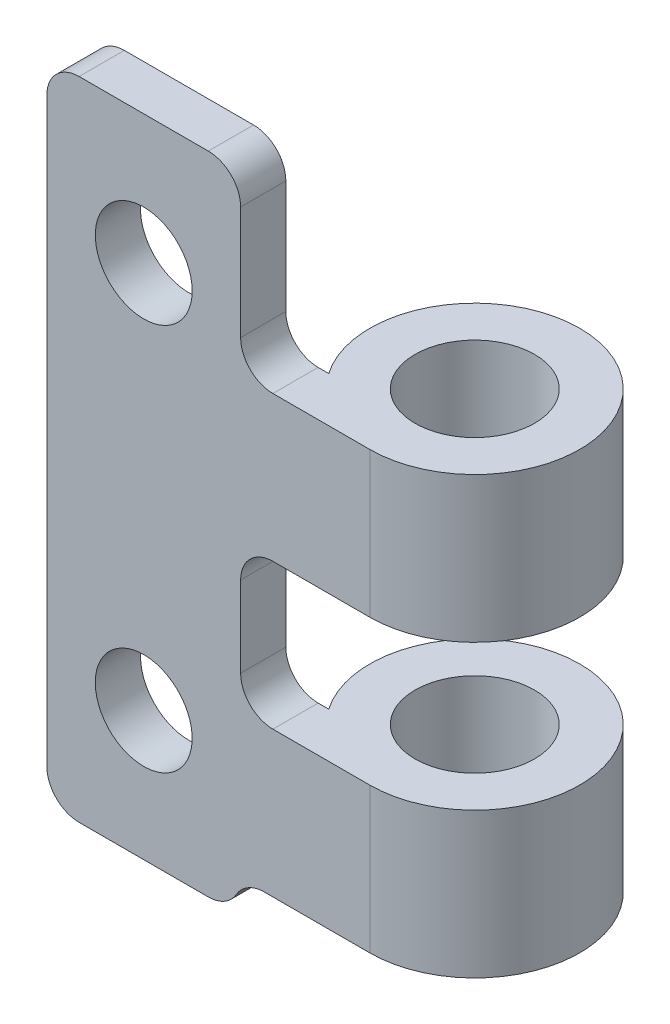
ISO-10303-21;
HEADER;
FILE_DESCRIPTION(('STEP AP214'),'2;1');
FILE_NAME('part.step','',(''),(''),'','','');
FILE_SCHEMA(('AUTOMOTIVE_DESIGN { 1 0 10303 214 1 1 1 1 }'));
ENDSEC;
DATA;
#1=APPLICATION_CONTEXT('core data for automotive mechanical design processes');
#2=APPLICATION_PROTOCOL_DEFINITION('international standard','automotive_design',2000,#1);
#3=PRODUCT_CONTEXT('',#1,'mechanical');
#4=PRODUCT('Part','Part','',(#3));
#5=PRODUCT_RELATED_PRODUCT_CATEGORY('part','',(#4));
#6=PRODUCT_DEFINITION_FORMATION('','',#4);
#7=PRODUCT_DEFINITION_CONTEXT('part definition',#1,'design');
#8=PRODUCT_DEFINITION('design','',#6,#7);
#9=PRODUCT_DEFINITION_SHAPE('','',#8);
#10=(LENGTH_UNIT() NAMED_UNIT(*) SI_UNIT(.MILLI.,.METRE.));
#11=(NAMED_UNIT(*) PLANE_ANGLE_UNIT() SI_UNIT($,.RADIAN.));
#12=(NAMED_UNIT(*) SI_UNIT($,.STERADIAN.) SOLID_ANGLE_UNIT());
#13=UNCERTAINTY_MEASURE_WITH_UNIT(LENGTH_MEASURE(1.E-05),#10,'distance_accuracy_value','');
#14=(GEOMETRIC_REPRESENTATION_CONTEXT(3) GLOBAL_UNCERTAINTY_ASSIGNED_CONTEXT((#13)) GLOBAL_UNIT_ASSIGNED_CONTEXT((#10,
#11,#12)) REPRESENTATION_CONTEXT('',''));
#15=CARTESIAN_POINT('',(0.,0.,0.));
#16=DIRECTION('',(0.,0.,1.));
#17=DIRECTION('',(1.,0.,0.));
#18=AXIS2_PLACEMENT_3D('',#15,#16,#17);
#19=CARTESIAN_POINT('',(2.,-9.,0.));
#20=DIRECTION('',(0.,0.,1.));
#21=DIRECTION('',(1.,0.,0.));
#22=AXIS2_PLACEMENT_3D('',#19,#20,#21);
#23=PLANE('',#22);
#24=CARTESIAN_POINT('',(0.,-6.,0.));
#25=DIRECTION('',(0.,0.,1.));
#26=DIRECTION('',(-1.,0.,0.));
#27=AXIS2_PLACEMENT_3D('',#24,#25,#26);
#28=CIRCLE('',#27,1.5);
#29=CARTESIAN_POINT('',(-1.5,-6.,0.));
#30=VERTEX_POINT('',#29);
#31=EDGE_CURVE('E232',#30,#30,#28,.T.);
#32=ORIENTED_EDGE('',*,*,#31,.T.);
#33=EDGE_LOOP('',(#32));
#34=FACE_BOUND('',#33,.T.);
#35=CARTESIAN_POINT('',(0.,6.,0.));
#36=DIRECTION('',(0.,0.,1.));
#37=DIRECTION('',(1.,0.,0.));
#38=AXIS2_PLACEMENT_3D('',#35,#36,#37);
#39=CIRCLE('',#38,1.5);
#40=CARTESIAN_POINT('',(1.5,6.,0.));
#41=VERTEX_POINT('',#40);
#42=EDGE_CURVE('E236',#41,#41,#39,.T.);
#43=ORIENTED_EDGE('',*,*,#42,.T.);
#44=EDGE_LOOP('',(#43));
#45=FACE_BOUND('',#44,.T.);
#46=DIRECTION('',(0.,1.,0.));
#47=VECTOR('',#46,1.);
#48=CARTESIAN_POINT('',(4.32792215682252,-13.6923881554251,0.));
#49=LINE('',#48,#47);
#50=CARTESIAN_POINT('',(4.32792215682252,0.,0.));
#51=VERTEX_POINT('',#50);
#52=CARTESIAN_POINT('',(4.32792215682252,4.5,0.));
#53=VERTEX_POINT('',#52);
#54=EDGE_CURVE('E182',#51,#53,#49,.T.);
#55=ORIENTED_EDGE('',*,*,#54,.F.);
#56=DIRECTION('',(1.,0.,0.));
#57=VECTOR('',#56,1.);
#58=CARTESIAN_POINT('',(3.,0.,0.));
#59=LINE('',#58,#57);
#60=CARTESIAN_POINT('',(4.,0.,0.));
#61=VERTEX_POINT('',#60);
#62=EDGE_CURVE('E195',#61,#51,#59,.T.);
#63=ORIENTED_EDGE('',*,*,#62,.F.);
#64=CARTESIAN_POINT('',(4.,-1.,0.));
#65=DIRECTION('',(0.,0.,1.));
#66=DIRECTION('',(1.,0.,0.));
#67=AXIS2_PLACEMENT_3D('',#64,#65,#66);
#68=CIRCLE('',#67,1.);
#69=CARTESIAN_POINT('',(3.,-1.,0.));
#70=VERTEX_POINT('',#69);
#71=EDGE_CURVE('E327',#61,#70,#68,.T.);
#72=ORIENTED_EDGE('',*,*,#71,.T.);
#73=DIRECTION('',(0.,1.,0.));
#74=VECTOR('',#73,1.);
#75=CARTESIAN_POINT('',(3.,-8.99999999999999,0.));
#76=LINE('',#75,#74);
#77=CARTESIAN_POINT('',(3.,-3.5,0.));
#78=VERTEX_POINT('',#77);
#79=EDGE_CURVE('E268',#78,#70,#76,.T.);
#80=ORIENTED_EDGE('',*,*,#79,.F.);
#81=CARTESIAN_POINT('',(4.,-3.5,0.));
#82=DIRECTION('',(0.,0.,1.));
#83=DIRECTION('',(1.,0.,0.));
#84=AXIS2_PLACEMENT_3D('',#81,#82,#83);
#85=CIRCLE('',#84,1.);
#86=CARTESIAN_POINT('',(4.,-4.5,0.));
#87=VERTEX_POINT('',#86);
#88=EDGE_CURVE('E323',#78,#87,#85,.T.);
#89=ORIENTED_EDGE('',*,*,#88,.T.);
#90=DIRECTION('',(1.,0.,0.));
#91=VECTOR('',#90,1.);
#92=CARTESIAN_POINT('',(3.,-4.5,0.));
#93=LINE('',#92,#91);
#94=CARTESIAN_POINT('',(4.32792215682252,-4.5,0.));
#95=VERTEX_POINT('',#94);
#96=EDGE_CURVE('E220',#87,#95,#93,.T.);
#97=ORIENTED_EDGE('',*,*,#96,.T.);
#98=DIRECTION('',(0.,-1.,0.));
#99=VECTOR('',#98,1.);
#100=CARTESIAN_POINT('',(4.32792215682252,4.69238815542511,0.));
#101=LINE('',#100,#99);
#102=CARTESIAN_POINT('',(4.32792215682252,-9.,0.));
#103=VERTEX_POINT('',#102);
#104=EDGE_CURVE('E216',#95,#103,#101,.T.);
#105=ORIENTED_EDGE('',*,*,#104,.T.);
#106=DIRECTION('',(1.,0.,0.));
#107=VECTOR('',#106,1.);
#108=CARTESIAN_POINT('',(3.,-9.,0.));
#109=LINE('',#108,#107);
#110=CARTESIAN_POINT('',(3.73205080756888,-9.,0.));
#111=VERTEX_POINT('',#110);
#112=EDGE_CURVE('E219',#111,#103,#109,.T.);
#113=ORIENTED_EDGE('',*,*,#112,.F.);
#114=CARTESIAN_POINT('',(3.73205080756888,-10.,0.));
#115=DIRECTION('',(0.,0.,1.));
#116=DIRECTION('',(1.,0.,0.));
#117=AXIS2_PLACEMENT_3D('',#114,#115,#116);
#118=CIRCLE('',#117,1.);
#119=CARTESIAN_POINT('',(2.86602540378444,-9.5,0.));
#120=VERTEX_POINT('',#119);
#121=EDGE_CURVE('E319',#111,#120,#118,.T.);
#122=ORIENTED_EDGE('',*,*,#121,.T.);
#123=CARTESIAN_POINT('',(2.,-9.,0.));
#124=DIRECTION('',(0.,0.,1.));
#125=DIRECTION('',(1.,0.,0.));
#126=AXIS2_PLACEMENT_3D('',#123,#124,#125);
#127=CIRCLE('',#126,0.999999999999999);
#128=CARTESIAN_POINT('',(1.99999999999999,-10.,0.));
#129=VERTEX_POINT('',#128);
#130=EDGE_CURVE('E242',#129,#120,#127,.T.);
#131=ORIENTED_EDGE('',*,*,#130,.F.);
#132=DIRECTION('',(1.,0.,0.));
#133=VECTOR('',#132,1.);
#134=CARTESIAN_POINT('',(-1.99999999999999,-10.,0.));
#135=LINE('',#134,#133);
#136=CARTESIAN_POINT('',(-1.99999999999999,-10.,0.));
#137=VERTEX_POINT('',#136);
#138=EDGE_CURVE('E248',#137,#129,#135,.T.);
#139=ORIENTED_EDGE('',*,*,#138,.F.);
#140=CARTESIAN_POINT('',(-2.,-9.,0.));
#141=DIRECTION('',(0.,0.,1.));
#142=DIRECTION('',(-1.,0.,0.));
#143=AXIS2_PLACEMENT_3D('',#140,#141,#142);
#144=CIRCLE('',#143,0.999999999999999);
#145=CARTESIAN_POINT('',(-3.,-9.,0.));
#146=VERTEX_POINT('',#145);
#147=EDGE_CURVE('E277',#146,#137,#144,.T.);
#148=ORIENTED_EDGE('',*,*,#147,.F.);
#149=DIRECTION('',(0.,-1.,0.));
#150=VECTOR('',#149,1.);
#151=CARTESIAN_POINT('',(-3.,-8.99999999999999,0.));
#152=LINE('',#151,#150);
#153=CARTESIAN_POINT('',(-3.,8.99999999999999,0.));
#154=VERTEX_POINT('',#153);
#155=EDGE_CURVE('E275',#154,#146,#152,.T.);
#156=ORIENTED_EDGE('',*,*,#155,.F.);
#157=CARTESIAN_POINT('',(-2.,9.,0.));
#158=DIRECTION('',(0.,0.,1.));
#159=DIRECTION('',(-1.,0.,0.));
#160=AXIS2_PLACEMENT_3D('',#157,#158,#159);
#161=CIRCLE('',#160,0.999999999999999);
#162=CARTESIAN_POINT('',(-1.99999999999999,10.,0.));
#163=VERTEX_POINT('',#162);
#164=EDGE_CURVE('E273',#163,#154,#161,.T.);
#165=ORIENTED_EDGE('',*,*,#164,.F.);
#166=DIRECTION('',(-1.,0.,0.));
#167=VECTOR('',#166,1.);
#168=CARTESIAN_POINT('',(-1.99999999999999,10.,0.));
#169=LINE('',#168,#167);
#170=CARTESIAN_POINT('',(1.99999999999999,10.,0.));
#171=VERTEX_POINT('',#170);
#172=EDGE_CURVE('E271',#171,#163,#169,.T.);
#173=ORIENTED_EDGE('',*,*,#172,.F.);
#174=CARTESIAN_POINT('',(2.,9.,0.));
#175=DIRECTION('',(0.,0.,1.));
#176=DIRECTION('',(-1.,0.,0.));
#177=AXIS2_PLACEMENT_3D('',#174,#175,#176);
#178=CIRCLE('',#177,0.999999999999999);
#179=CARTESIAN_POINT('',(3.,8.99999999999999,0.));
#180=VERTEX_POINT('',#179);
#181=EDGE_CURVE('E269',#180,#171,#178,.T.);
#182=ORIENTED_EDGE('',*,*,#181,.F.);
#183=CARTESIAN_POINT('',(3.,5.5,0.));
#184=VERTEX_POINT('',#183);
#185=EDGE_CURVE('E266',#184,#180,#76,.T.);
#186=ORIENTED_EDGE('',*,*,#185,.F.);
#187=CARTESIAN_POINT('',(4.,5.5,0.));
#188=DIRECTION('',(0.,0.,1.));
#189=DIRECTION('',(1.,0.,0.));
#190=AXIS2_PLACEMENT_3D('',#187,#188,#189);
#191=CIRCLE('',#190,1.);
#192=CARTESIAN_POINT('',(4.,4.5,0.));
#193=VERTEX_POINT('',#192);
#194=EDGE_CURVE('E52',#184,#193,#191,.T.);
#195=ORIENTED_EDGE('',*,*,#194,.T.);
#196=DIRECTION('',(1.,0.,0.));
#197=VECTOR('',#196,1.);
#198=CARTESIAN_POINT('',(3.,4.5,0.));
#199=LINE('',#198,#197);
#200=EDGE_CURVE('E198',#193,#53,#199,.T.);
#201=ORIENTED_EDGE('',*,*,#200,.T.);
#202=EDGE_LOOP('',(#55,#63,#72,#80,#89,#97,#105,#113,#122,#131,#139,#148,#156,#165,#173,#182,
#186,#195,#201));
#203=FACE_BOUND('',#202,.T.);
#204=ADVANCED_FACE('F44',(#34,#45,#203),#23,.F.);
#205=CARTESIAN_POINT('',(3.,-8.99999999999999,1.4));
#206=DIRECTION('',(-1.,0.,0.));
#207=DIRECTION('',(0.,0.,1.));
#208=AXIS2_PLACEMENT_3D('',#205,#206,#207);
#209=PLANE('',#208);
#210=DIRECTION('',(0.,1.,0.));
#211=VECTOR('',#210,1.);
#212=CARTESIAN_POINT('',(3.,-8.99999999999999,1.4));
#213=LINE('',#212,#211);
#214=CARTESIAN_POINT('',(3.,5.5,1.4));
#215=VERTEX_POINT('',#214);
#216=CARTESIAN_POINT('',(3.,8.99999999999999,1.4));
#217=VERTEX_POINT('',#216);
#218=EDGE_CURVE('E247',#215,#217,#213,.T.);
#219=ORIENTED_EDGE('',*,*,#218,.F.);
#220=DIRECTION('',(0.,0.,-1.));
#221=VECTOR('',#220,1.);
#222=CARTESIAN_POINT('',(3.,5.5,0.));
#223=LINE('',#222,#221);
#224=EDGE_CURVE('E315',#215,#184,#223,.T.);
#225=ORIENTED_EDGE('',*,*,#224,.T.);
#226=ORIENTED_EDGE('',*,*,#185,.T.);
#227=DIRECTION('',(0.,0.,-1.));
#228=VECTOR('',#227,1.);
#229=CARTESIAN_POINT('',(3.,8.99999999999999,1.4));
#230=LINE('',#229,#228);
#231=EDGE_CURVE('E297',#217,#180,#230,.T.);
#232=ORIENTED_EDGE('',*,*,#231,.F.);
#233=EDGE_LOOP('',(#219,#225,#226,#232));
#234=FACE_BOUND('',#233,.T.);
#235=ADVANCED_FACE('F403',(#234),#209,.F.);
#236=CARTESIAN_POINT('',(2.,-9.,1.4));
#237=DIRECTION('',(0.,0.,1.));
#238=DIRECTION('',(1.,0.,0.));
#239=AXIS2_PLACEMENT_3D('',#236,#237,#238);
#240=PLANE('',#239);
#241=CARTESIAN_POINT('',(0.,6.,1.4));
#242=DIRECTION('',(0.,0.,1.));
#243=DIRECTION('',(1.,0.,0.));
#244=AXIS2_PLACEMENT_3D('',#241,#242,#243);
#245=CIRCLE('',#244,1.5);
#246=CARTESIAN_POINT('',(1.5,6.,1.4));
#247=VERTEX_POINT('',#246);
#248=EDGE_CURVE('E239',#247,#247,#245,.T.);
#249=ORIENTED_EDGE('',*,*,#248,.F.);
#250=EDGE_LOOP('',(#249));
#251=FACE_BOUND('',#250,.T.);
#252=CARTESIAN_POINT('',(2.,-9.,1.4));
#253=DIRECTION('',(0.,0.,1.));
#254=DIRECTION('',(1.,0.,0.));
#255=AXIS2_PLACEMENT_3D('',#252,#253,#254);
#256=CIRCLE('',#255,0.999999999999999);
#257=CARTESIAN_POINT('',(1.99999999999999,-10.,1.4));
#258=VERTEX_POINT('',#257);
#259=CARTESIAN_POINT('',(2.86602540378444,-9.5,1.4));
#260=VERTEX_POINT('',#259);
#261=EDGE_CURVE('E245',#258,#260,#256,.T.);
#262=ORIENTED_EDGE('',*,*,#261,.T.);
#263=CARTESIAN_POINT('',(3.73205080756888,-10.,1.4));
#264=DIRECTION('',(0.,0.,1.));
#265=DIRECTION('',(1.,0.,0.));
#266=AXIS2_PLACEMENT_3D('',#263,#264,#265);
#267=CIRCLE('',#266,1.);
#268=CARTESIAN_POINT('',(3.73205080756888,-9.,1.4));
#269=VERTEX_POINT('',#268);
#270=EDGE_CURVE('E321',#260,#269,#267,.F.);
#271=ORIENTED_EDGE('',*,*,#270,.T.);
#272=DIRECTION('',(-1.,0.,0.));
#273=VECTOR('',#272,1.);
#274=CARTESIAN_POINT('',(3.,-9.,1.4));
#275=LINE('',#274,#273);
#276=CARTESIAN_POINT('',(7.,-9.,1.4));
#277=VERTEX_POINT('',#276);
#278=EDGE_CURVE('E223',#277,#269,#275,.T.);
#279=ORIENTED_EDGE('',*,*,#278,.F.);
#280=DIRECTION('',(0.,-1.,0.));
#281=VECTOR('',#280,1.);
#282=CARTESIAN_POINT('',(7.,-4.5,1.4));
#283=LINE('',#282,#281);
#284=CARTESIAN_POINT('',(7.,-4.5,1.4));
#285=VERTEX_POINT('',#284);
#286=EDGE_CURVE('E226',#285,#277,#283,.T.);
#287=ORIENTED_EDGE('',*,*,#286,.F.);
#288=DIRECTION('',(-1.,0.,0.));
#289=VECTOR('',#288,1.);
#290=CARTESIAN_POINT('',(3.,-4.5,1.4));
#291=LINE('',#290,#289);
#292=CARTESIAN_POINT('',(4.,-4.5,1.4));
#293=VERTEX_POINT('',#292);
#294=EDGE_CURVE('E222',#285,#293,#291,.T.);
#295=ORIENTED_EDGE('',*,*,#294,.T.);
#296=CARTESIAN_POINT('',(4.,-3.5,1.4));
#297=DIRECTION('',(0.,0.,1.));
#298=DIRECTION('',(1.,0.,0.));
#299=AXIS2_PLACEMENT_3D('',#296,#297,#298);
#300=CIRCLE('',#299,1.);
#301=CARTESIAN_POINT('',(3.,-3.5,1.4));
#302=VERTEX_POINT('',#301);
#303=EDGE_CURVE('E325',#293,#302,#300,.F.);
#304=ORIENTED_EDGE('',*,*,#303,.T.);
#305=CARTESIAN_POINT('',(3.,-1.,1.4));
#306=VERTEX_POINT('',#305);
#307=EDGE_CURVE('E250',#302,#306,#213,.T.);
#308=ORIENTED_EDGE('',*,*,#307,.T.);
#309=CARTESIAN_POINT('',(4.,-1.,1.4));
#310=DIRECTION('',(0.,0.,1.));
#311=DIRECTION('',(1.,0.,0.));
#312=AXIS2_PLACEMENT_3D('',#309,#310,#311);
#313=CIRCLE('',#312,1.);
#314=CARTESIAN_POINT('',(4.,0.,1.4));
#315=VERTEX_POINT('',#314);
#316=EDGE_CURVE('E329',#306,#315,#313,.F.);
#317=ORIENTED_EDGE('',*,*,#316,.T.);
#318=DIRECTION('',(-1.,0.,0.));
#319=VECTOR('',#318,1.);
#320=CARTESIAN_POINT('',(3.,0.,1.4));
#321=LINE('',#320,#319);
#322=CARTESIAN_POINT('',(7.,0.,1.4));
#323=VERTEX_POINT('',#322);
#324=EDGE_CURVE('E193',#323,#315,#321,.T.);
#325=ORIENTED_EDGE('',*,*,#324,.F.);
#326=DIRECTION('',(0.,1.,0.));
#327=VECTOR('',#326,1.);
#328=CARTESIAN_POINT('',(7.,0.,1.4));
#329=LINE('',#328,#327);
#330=CARTESIAN_POINT('',(7.,4.5,1.4));
#331=VERTEX_POINT('',#330);
#332=EDGE_CURVE('E179',#323,#331,#329,.T.);
#333=ORIENTED_EDGE('',*,*,#332,.T.);
#334=DIRECTION('',(-1.,0.,0.));
#335=VECTOR('',#334,1.);
#336=CARTESIAN_POINT('',(3.,4.5,1.4));
#337=LINE('',#336,#335);
#338=CARTESIAN_POINT('',(4.,4.5,1.4));
#339=VERTEX_POINT('',#338);
#340=EDGE_CURVE('E190',#331,#339,#337,.T.);
#341=ORIENTED_EDGE('',*,*,#340,.T.);
#342=CARTESIAN_POINT('',(4.,5.5,1.4));
#343=DIRECTION('',(0.,0.,1.));
#344=DIRECTION('',(1.,0.,0.));
#345=AXIS2_PLACEMENT_3D('',#342,#343,#344);
#346=CIRCLE('',#345,1.);
#347=EDGE_CURVE('E11',#339,#215,#346,.F.);
#348=ORIENTED_EDGE('',*,*,#347,.T.);
#349=ORIENTED_EDGE('',*,*,#218,.T.);
#350=CARTESIAN_POINT('',(2.,9.,1.4));
#351=DIRECTION('',(0.,0.,1.));
#352=DIRECTION('',(-1.,0.,0.));
#353=AXIS2_PLACEMENT_3D('',#350,#351,#352);
#354=CIRCLE('',#353,0.999999999999999);
#355=CARTESIAN_POINT('',(1.99999999999999,10.,1.4));
#356=VERTEX_POINT('',#355);
#357=EDGE_CURVE('E251',#217,#356,#354,.T.);
#358=ORIENTED_EDGE('',*,*,#357,.T.);
#359=DIRECTION('',(-1.,0.,0.));
#360=VECTOR('',#359,1.);
#361=CARTESIAN_POINT('',(-1.99999999999999,10.,1.4));
#362=LINE('',#361,#360);
#363=CARTESIAN_POINT('',(-1.99999999999999,10.,1.4));
#364=VERTEX_POINT('',#363);
#365=EDGE_CURVE('E253',#356,#364,#362,.T.);
#366=ORIENTED_EDGE('',*,*,#365,.T.);
#367=CARTESIAN_POINT('',(-2.,9.,1.4));
#368=DIRECTION('',(0.,0.,1.));
#369=DIRECTION('',(-1.,0.,0.));
#370=AXIS2_PLACEMENT_3D('',#367,#368,#369);
#371=CIRCLE('',#370,0.999999999999999);
#372=CARTESIAN_POINT('',(-3.,8.99999999999999,1.4));
#373=VERTEX_POINT('',#372);
#374=EDGE_CURVE('E255',#364,#373,#371,.T.);
#375=ORIENTED_EDGE('',*,*,#374,.T.);
#376=DIRECTION('',(0.,-1.,0.));
#377=VECTOR('',#376,1.);
#378=CARTESIAN_POINT('',(-3.,-8.99999999999999,1.4));
#379=LINE('',#378,#377);
#380=CARTESIAN_POINT('',(-3.,-9.,1.4));
#381=VERTEX_POINT('',#380);
#382=EDGE_CURVE('E257',#373,#381,#379,.T.);
#383=ORIENTED_EDGE('',*,*,#382,.T.);
#384=CARTESIAN_POINT('',(-2.,-9.,1.4));
#385=DIRECTION('',(0.,0.,1.));
#386=DIRECTION('',(-1.,0.,0.));
#387=AXIS2_PLACEMENT_3D('',#384,#385,#386);
#388=CIRCLE('',#387,0.999999999999999);
#389=CARTESIAN_POINT('',(-1.99999999999999,-10.,1.4));
#390=VERTEX_POINT('',#389);
#391=EDGE_CURVE('E259',#381,#390,#388,.T.);
#392=ORIENTED_EDGE('',*,*,#391,.T.);
#393=DIRECTION('',(1.,0.,0.));
#394=VECTOR('',#393,1.);
#395=CARTESIAN_POINT('',(-1.99999999999999,-10.,1.4));
#396=LINE('',#395,#394);
#397=EDGE_CURVE('E261',#390,#258,#396,.T.);
#398=ORIENTED_EDGE('',*,*,#397,.T.);
#399=EDGE_LOOP('',(#262,#271,#279,#287,#295,#304,#308,#317,#325,#333,#341,#348,#349,#358,#366,
#375,#383,#392,#398));
#400=FACE_BOUND('',#399,.T.);
#401=CARTESIAN_POINT('',(0.,-6.,1.4));
#402=DIRECTION('',(0.,0.,1.));
#403=DIRECTION('',(-1.,0.,0.));
#404=AXIS2_PLACEMENT_3D('',#401,#402,#403);
#405=CIRCLE('',#404,1.5);
#406=CARTESIAN_POINT('',(-1.5,-6.,1.4));
#407=VERTEX_POINT('',#406);
#408=EDGE_CURVE('E233',#407,#407,#405,.T.);
#409=ORIENTED_EDGE('',*,*,#408,.F.);
#410=EDGE_LOOP('',(#409));
#411=FACE_BOUND('',#410,.T.);
#412=ADVANCED_FACE('F188',(#251,#400,#411),#240,.T.);
#413=CARTESIAN_POINT('',(2.,-9.,1.4));
#414=DIRECTION('',(0.,0.,-1.));
#415=DIRECTION('',(-1.,0.,0.));
#416=AXIS2_PLACEMENT_3D('',#413,#414,#415);
#417=CYLINDRICAL_SURFACE('',#416,0.999999999999999);
#418=ORIENTED_EDGE('',*,*,#130,.T.);
#419=DIRECTION('',(0.,0.,-1.));
#420=VECTOR('',#419,1.);
#421=CARTESIAN_POINT('',(2.86602540378444,-9.5,1.4));
#422=LINE('',#421,#420);
#423=EDGE_CURVE('E303',#120,#260,#422,.F.);
#424=ORIENTED_EDGE('',*,*,#423,.T.);
#425=ORIENTED_EDGE('',*,*,#261,.F.);
#426=DIRECTION('',(0.,0.,-1.));
#427=VECTOR('',#426,1.);
#428=CARTESIAN_POINT('',(1.99999999999999,-10.,1.4));
#429=LINE('',#428,#427);
#430=EDGE_CURVE('E263',#258,#129,#429,.T.);
#431=ORIENTED_EDGE('',*,*,#430,.T.);
#432=EDGE_LOOP('',(#418,#424,#425,#431));
#433=FACE_BOUND('',#432,.T.);
#434=ADVANCED_FACE('F369',(#433),#417,.T.);
#435=ORIENTED_EDGE('',*,*,#307,.F.);
#436=DIRECTION('',(0.,0.,-1.));
#437=VECTOR('',#436,1.);
#438=CARTESIAN_POINT('',(3.,-3.5,1.4));
#439=LINE('',#438,#437);
#440=EDGE_CURVE('E307',#302,#78,#439,.T.);
#441=ORIENTED_EDGE('',*,*,#440,.T.);
#442=ORIENTED_EDGE('',*,*,#79,.T.);
#443=DIRECTION('',(0.,0.,-1.));
#444=VECTOR('',#443,1.);
#445=CARTESIAN_POINT('',(3.,-1.,1.4));
#446=LINE('',#445,#444);
#447=EDGE_CURVE('E305',#70,#306,#446,.F.);
#448=ORIENTED_EDGE('',*,*,#447,.T.);
#449=EDGE_LOOP('',(#435,#441,#442,#448));
#450=FACE_BOUND('',#449,.T.);
#451=ADVANCED_FACE('F343',(#450),#209,.F.);
#452=CARTESIAN_POINT('',(2.,9.,1.4));
#453=DIRECTION('',(0.,0.,-1.));
#454=DIRECTION('',(-1.,0.,0.));
#455=AXIS2_PLACEMENT_3D('',#452,#453,#454);
#456=CYLINDRICAL_SURFACE('',#455,0.999999999999999);
#457=ORIENTED_EDGE('',*,*,#181,.T.);
#458=DIRECTION('',(0.,0.,-1.));
#459=VECTOR('',#458,1.);
#460=CARTESIAN_POINT('',(1.99999999999999,10.,1.4));
#461=LINE('',#460,#459);
#462=EDGE_CURVE('E294',#356,#171,#461,.T.);
#463=ORIENTED_EDGE('',*,*,#462,.F.);
#464=ORIENTED_EDGE('',*,*,#357,.F.);
#465=ORIENTED_EDGE('',*,*,#231,.T.);
#466=EDGE_LOOP('',(#457,#463,#464,#465));
#467=FACE_BOUND('',#466,.T.);
#468=ADVANCED_FACE('F399',(#467),#456,.T.);
#469=CARTESIAN_POINT('',(-1.99999999999999,10.,1.4));
#470=DIRECTION('',(0.,-1.,0.));
#471=DIRECTION('',(0.,0.,-1.));
#472=AXIS2_PLACEMENT_3D('',#469,#470,#471);
#473=PLANE('',#472);
#474=ORIENTED_EDGE('',*,*,#172,.T.);
#475=DIRECTION('',(0.,0.,-1.));
#476=VECTOR('',#475,1.);
#477=CARTESIAN_POINT('',(-1.99999999999999,10.,1.4));
#478=LINE('',#477,#476);
#479=EDGE_CURVE('E291',#364,#163,#478,.T.);
#480=ORIENTED_EDGE('',*,*,#479,.F.);
#481=ORIENTED_EDGE('',*,*,#365,.F.);
#482=ORIENTED_EDGE('',*,*,#462,.T.);
#483=EDGE_LOOP('',(#474,#480,#481,#482));
#484=FACE_BOUND('',#483,.T.);
#485=ADVANCED_FACE('F394',(#484),#473,.F.);
#486=CARTESIAN_POINT('',(-2.,9.,1.4));
#487=DIRECTION('',(0.,0.,-1.));
#488=DIRECTION('',(-1.,0.,0.));
#489=AXIS2_PLACEMENT_3D('',#486,#487,#488);
#490=CYLINDRICAL_SURFACE('',#489,0.999999999999999);
#491=ORIENTED_EDGE('',*,*,#164,.T.);
#492=DIRECTION('',(0.,0.,-1.));
#493=VECTOR('',#492,1.);
#494=CARTESIAN_POINT('',(-3.,8.99999999999999,1.4));
#495=LINE('',#494,#493);
#496=EDGE_CURVE('E288',#373,#154,#495,.T.);
#497=ORIENTED_EDGE('',*,*,#496,.F.);
#498=ORIENTED_EDGE('',*,*,#374,.F.);
#499=ORIENTED_EDGE('',*,*,#479,.T.);
#500=EDGE_LOOP('',(#491,#497,#498,#499));
#501=FACE_BOUND('',#500,.T.);
#502=ADVANCED_FACE('F389',(#501),#490,.T.);
#503=CARTESIAN_POINT('',(-3.,-8.99999999999999,1.4));
#504=DIRECTION('',(1.,0.,0.));
#505=DIRECTION('',(0.,0.,-1.));
#506=AXIS2_PLACEMENT_3D('',#503,#504,#505);
#507=PLANE('',#506);
#508=ORIENTED_EDGE('',*,*,#155,.T.);
#509=DIRECTION('',(0.,0.,-1.));
#510=VECTOR('',#509,1.);
#511=CARTESIAN_POINT('',(-3.,-9.,1.4));
#512=LINE('',#511,#510);
#513=EDGE_CURVE('E285',#381,#146,#512,.T.);
#514=ORIENTED_EDGE('',*,*,#513,.F.);
#515=ORIENTED_EDGE('',*,*,#382,.F.);
#516=ORIENTED_EDGE('',*,*,#496,.T.);
#517=EDGE_LOOP('',(#508,#514,#515,#516));
#518=FACE_BOUND('',#517,.T.);
#519=ADVANCED_FACE('F385',(#518),#507,.F.);
#520=CARTESIAN_POINT('',(-2.,-9.,1.4));
#521=DIRECTION('',(0.,0.,-1.));
#522=DIRECTION('',(-1.,0.,0.));
#523=AXIS2_PLACEMENT_3D('',#520,#521,#522);
#524=CYLINDRICAL_SURFACE('',#523,0.999999999999999);
#525=ORIENTED_EDGE('',*,*,#147,.T.);
#526=DIRECTION('',(0.,0.,-1.));
#527=VECTOR('',#526,1.);
#528=CARTESIAN_POINT('',(-1.99999999999999,-10.,1.4));
#529=LINE('',#528,#527);
#530=EDGE_CURVE('E282',#390,#137,#529,.T.);
#531=ORIENTED_EDGE('',*,*,#530,.F.);
#532=ORIENTED_EDGE('',*,*,#391,.F.);
#533=ORIENTED_EDGE('',*,*,#513,.T.);
#534=EDGE_LOOP('',(#525,#531,#532,#533));
#535=FACE_BOUND('',#534,.T.);
#536=ADVANCED_FACE('F381',(#535),#524,.T.);
#537=CARTESIAN_POINT('',(-1.99999999999999,-10.,1.4));
#538=DIRECTION('',(0.,1.,0.));
#539=DIRECTION('',(0.,0.,1.));
#540=AXIS2_PLACEMENT_3D('',#537,#538,#539);
#541=PLANE('',#540);
#542=ORIENTED_EDGE('',*,*,#138,.T.);
#543=ORIENTED_EDGE('',*,*,#430,.F.);
#544=ORIENTED_EDGE('',*,*,#397,.F.);
#545=ORIENTED_EDGE('',*,*,#530,.T.);
#546=EDGE_LOOP('',(#542,#543,#544,#545));
#547=FACE_BOUND('',#546,.T.);
#548=ADVANCED_FACE('F375',(#547),#541,.F.);
#549=CARTESIAN_POINT('',(0.,6.,1.4));
#550=DIRECTION('',(0.,0.,-1.));
#551=DIRECTION('',(-1.,0.,0.));
#552=AXIS2_PLACEMENT_3D('',#549,#550,#551);
#553=CYLINDRICAL_SURFACE('',#552,1.5);
#554=ORIENTED_EDGE('',*,*,#248,.T.);
#555=EDGE_LOOP('',(#554));
#556=FACE_BOUND('',#555,.T.);
#557=ORIENTED_EDGE('',*,*,#42,.F.);
#558=EDGE_LOOP('',(#557));
#559=FACE_BOUND('',#558,.T.);
#560=ADVANCED_FACE('F423',(#556,#559),#553,.F.);
#561=CARTESIAN_POINT('',(0.,-6.,1.4));
#562=DIRECTION('',(0.,0.,-1.));
#563=DIRECTION('',(-1.,0.,0.));
#564=AXIS2_PLACEMENT_3D('',#561,#562,#563);
#565=CYLINDRICAL_SURFACE('',#564,1.5);
#566=ORIENTED_EDGE('',*,*,#408,.T.);
#567=EDGE_LOOP('',(#566));
#568=FACE_BOUND('',#567,.T.);
#569=ORIENTED_EDGE('',*,*,#31,.F.);
#570=EDGE_LOOP('',(#569));
#571=FACE_BOUND('',#570,.T.);
#572=ADVANCED_FACE('F557',(#568,#571),#565,.F.);
#573=CARTESIAN_POINT('',(0.,-4.5,0.));
#574=DIRECTION('',(0.,1.,0.));
#575=DIRECTION('',(0.,0.,1.));
#576=AXIS2_PLACEMENT_3D('',#573,#574,#575);
#577=PLANE('',#576);
#578=CARTESIAN_POINT('',(7.,-4.5,-1.85));
#579=DIRECTION('',(0.,1.,0.));
#580=DIRECTION('',(0.,0.,1.));
#581=AXIS2_PLACEMENT_3D('',#578,#579,#580);
#582=CIRCLE('',#581,1.85);
#583=CARTESIAN_POINT('',(7.,-4.5,0.));
#584=VERTEX_POINT('',#583);
#585=EDGE_CURVE('E208',#584,#584,#582,.F.);
#586=ORIENTED_EDGE('',*,*,#585,.T.);
#587=EDGE_LOOP('',(#586));
#588=FACE_BOUND('',#587,.T.);
#589=ORIENTED_EDGE('',*,*,#96,.F.);
#590=DIRECTION('',(0.,0.,-1.));
#591=VECTOR('',#590,1.);
#592=CARTESIAN_POINT('',(4.,-4.5,0.));
#593=LINE('',#592,#591);
#594=EDGE_CURVE('E310',#87,#293,#593,.F.);
#595=ORIENTED_EDGE('',*,*,#594,.T.);
#596=ORIENTED_EDGE('',*,*,#294,.F.);
#597=CARTESIAN_POINT('',(7.,-4.5,-1.85));
#598=DIRECTION('',(0.,1.,0.));
#599=DIRECTION('',(0.,0.,1.));
#600=AXIS2_PLACEMENT_3D('',#597,#598,#599);
#601=CIRCLE('',#600,3.25);
#602=EDGE_CURVE('E194',#95,#285,#601,.F.);
#603=ORIENTED_EDGE('',*,*,#602,.F.);
#604=EDGE_LOOP('',(#589,#595,#596,#603));
#605=FACE_BOUND('',#604,.T.);
#606=ADVANCED_FACE('F353',(#588,#605),#577,.T.);
#607=CARTESIAN_POINT('',(0.,-9.,0.));
#608=DIRECTION('',(0.,1.,0.));
#609=DIRECTION('',(0.,0.,1.));
#610=AXIS2_PLACEMENT_3D('',#607,#608,#609);
#611=PLANE('',#610);
#612=CARTESIAN_POINT('',(7.,-9.,-1.85));
#613=DIRECTION('',(0.,-1.,0.));
#614=DIRECTION('',(0.,0.,-1.));
#615=AXIS2_PLACEMENT_3D('',#612,#613,#614);
#616=CIRCLE('',#615,1.85);
#617=CARTESIAN_POINT('',(7.,-9.,-3.7));
#618=VERTEX_POINT('',#617);
#619=EDGE_CURVE('E209',#618,#618,#616,.T.);
#620=ORIENTED_EDGE('',*,*,#619,.F.);
#621=EDGE_LOOP('',(#620));
#622=FACE_BOUND('',#621,.T.);
#623=ORIENTED_EDGE('',*,*,#278,.T.);
#624=DIRECTION('',(0.,0.,1.));
#625=VECTOR('',#624,1.);
#626=CARTESIAN_POINT('',(3.73205080756888,-9.,0.));
#627=LINE('',#626,#625);
#628=EDGE_CURVE('E300',#269,#111,#627,.F.);
#629=ORIENTED_EDGE('',*,*,#628,.T.);
#630=ORIENTED_EDGE('',*,*,#112,.T.);
#631=CARTESIAN_POINT('',(7.,-9.,-1.85));
#632=DIRECTION('',(0.,-1.,0.));
#633=DIRECTION('',(0.,0.,-1.));
#634=AXIS2_PLACEMENT_3D('',#631,#632,#633);
#635=CIRCLE('',#634,3.25);
#636=EDGE_CURVE('E205',#103,#277,#635,.T.);
#637=ORIENTED_EDGE('',*,*,#636,.T.);
#638=EDGE_LOOP('',(#623,#629,#630,#637));
#639=FACE_BOUND('',#638,.T.);
#640=ADVANCED_FACE('F361',(#622,#639),#611,.F.);
#641=CARTESIAN_POINT('',(7.,4.69238815542511,-1.85));
#642=DIRECTION('',(0.,-1.,0.));
#643=DIRECTION('',(0.,0.,-1.));
#644=AXIS2_PLACEMENT_3D('',#641,#642,#643);
#645=CYLINDRICAL_SURFACE('',#644,3.25);
#646=ORIENTED_EDGE('',*,*,#104,.F.);
#647=ORIENTED_EDGE('',*,*,#602,.T.);
#648=ORIENTED_EDGE('',*,*,#286,.T.);
#649=ORIENTED_EDGE('',*,*,#636,.F.);
#650=EDGE_LOOP('',(#646,#647,#648,#649));
#651=FACE_BOUND('',#650,.T.);
#652=ADVANCED_FACE('F356',(#651),#645,.T.);
#653=CARTESIAN_POINT('',(7.,4.69238815542511,-1.85));
#654=DIRECTION('',(0.,-1.,0.));
#655=DIRECTION('',(0.,0.,-1.));
#656=AXIS2_PLACEMENT_3D('',#653,#654,#655);
#657=CYLINDRICAL_SURFACE('',#656,1.85);
#658=ORIENTED_EDGE('',*,*,#619,.T.);
#659=EDGE_LOOP('',(#658));
#660=FACE_BOUND('',#659,.T.);
#661=ORIENTED_EDGE('',*,*,#585,.F.);
#662=EDGE_LOOP('',(#661));
#663=FACE_BOUND('',#662,.T.);
#664=ADVANCED_FACE('F513',(#660,#663),#657,.F.);
#665=CARTESIAN_POINT('',(0.,0.,0.));
#666=DIRECTION('',(0.,-1.,0.));
#667=DIRECTION('',(0.,0.,1.));
#668=AXIS2_PLACEMENT_3D('',#665,#666,#667);
#669=PLANE('',#668);
#670=CARTESIAN_POINT('',(7.,0.,-1.85));
#671=DIRECTION('',(0.,-1.,0.));
#672=DIRECTION('',(0.,0.,-1.));
#673=AXIS2_PLACEMENT_3D('',#670,#671,#672);
#674=CIRCLE('',#673,1.85);
#675=CARTESIAN_POINT('',(7.,0.,-3.7));
#676=VERTEX_POINT('',#675);
#677=EDGE_CURVE('E701',#676,#676,#674,.T.);
#678=ORIENTED_EDGE('',*,*,#677,.F.);
#679=EDGE_LOOP('',(#678));
#680=FACE_BOUND('',#679,.T.);
#681=ORIENTED_EDGE('',*,*,#324,.T.);
#682=DIRECTION('',(0.,0.,-1.));
#683=VECTOR('',#682,1.);
#684=CARTESIAN_POINT('',(4.,0.,0.));
#685=LINE('',#684,#683);
#686=EDGE_CURVE('E312',#315,#61,#685,.T.);
#687=ORIENTED_EDGE('',*,*,#686,.T.);
#688=ORIENTED_EDGE('',*,*,#62,.T.);
#689=CARTESIAN_POINT('',(7.,0.,-1.85));
#690=DIRECTION('',(0.,-1.,0.));
#691=DIRECTION('',(0.,0.,-1.));
#692=AXIS2_PLACEMENT_3D('',#689,#690,#691);
#693=CIRCLE('',#692,3.25);
#694=EDGE_CURVE('E183',#51,#323,#693,.T.);
#695=ORIENTED_EDGE('',*,*,#694,.T.);
#696=EDGE_LOOP('',(#681,#687,#688,#695));
#697=FACE_BOUND('',#696,.T.);
#698=ADVANCED_FACE('F337',(#680,#697),#669,.T.);
#699=CARTESIAN_POINT('',(0.,4.5,0.));
#700=DIRECTION('',(0.,-1.,0.));
#701=DIRECTION('',(0.,0.,1.));
#702=AXIS2_PLACEMENT_3D('',#699,#700,#701);
#703=PLANE('',#702);
#704=CARTESIAN_POINT('',(7.,4.5,-1.85));
#705=DIRECTION('',(0.,-1.,0.));
#706=DIRECTION('',(0.,0.,-1.));
#707=AXIS2_PLACEMENT_3D('',#704,#705,#706);
#708=CIRCLE('',#707,1.85);
#709=CARTESIAN_POINT('',(7.,4.5,-3.7));
#710=VERTEX_POINT('',#709);
#711=EDGE_CURVE('E184',#710,#710,#708,.T.);
#712=ORIENTED_EDGE('',*,*,#711,.T.);
#713=EDGE_LOOP('',(#712));
#714=FACE_BOUND('',#713,.T.);
#715=ORIENTED_EDGE('',*,*,#200,.F.);
#716=DIRECTION('',(0.,0.,-1.));
#717=VECTOR('',#716,1.);
#718=CARTESIAN_POINT('',(4.,4.5,1.4));
#719=LINE('',#718,#717);
#720=EDGE_CURVE('E65',#193,#339,#719,.F.);
#721=ORIENTED_EDGE('',*,*,#720,.T.);
#722=ORIENTED_EDGE('',*,*,#340,.F.);
#723=CARTESIAN_POINT('',(7.,4.5,-1.85));
#724=DIRECTION('',(0.,-1.,0.));
#725=DIRECTION('',(0.,0.,-1.));
#726=AXIS2_PLACEMENT_3D('',#723,#724,#725);
#727=CIRCLE('',#726,3.25);
#728=EDGE_CURVE('E175',#53,#331,#727,.T.);
#729=ORIENTED_EDGE('',*,*,#728,.F.);
#730=EDGE_LOOP('',(#715,#721,#722,#729));
#731=FACE_BOUND('',#730,.T.);
#732=ADVANCED_FACE('F197',(#714,#731),#703,.F.);
#733=CARTESIAN_POINT('',(7.,-13.6923881554251,-1.85));
#734=DIRECTION('',(0.,1.,0.));
#735=DIRECTION('',(0.,0.,1.));
#736=AXIS2_PLACEMENT_3D('',#733,#734,#735);
#737=CYLINDRICAL_SURFACE('',#736,3.25);
#738=ORIENTED_EDGE('',*,*,#694,.F.);
#739=ORIENTED_EDGE('',*,*,#54,.T.);
#740=ORIENTED_EDGE('',*,*,#728,.T.);
#741=ORIENTED_EDGE('',*,*,#332,.F.);
#742=EDGE_LOOP('',(#738,#739,#740,#741));
#743=FACE_BOUND('',#742,.T.);
#744=ADVANCED_FACE('F178',(#743),#737,.T.);
#745=CARTESIAN_POINT('',(7.,-13.6923881554251,-1.85));
#746=DIRECTION('',(0.,1.,0.));
#747=DIRECTION('',(0.,0.,1.));
#748=AXIS2_PLACEMENT_3D('',#745,#746,#747);
#749=CYLINDRICAL_SURFACE('',#748,1.85);
#750=ORIENTED_EDGE('',*,*,#677,.T.);
#751=EDGE_LOOP('',(#750));
#752=FACE_BOUND('',#751,.T.);
#753=ORIENTED_EDGE('',*,*,#711,.F.);
#754=EDGE_LOOP('',(#753));
#755=FACE_BOUND('',#754,.T.);
#756=ADVANCED_FACE('F439',(#752,#755),#749,.F.);
#757=CARTESIAN_POINT('',(3.73205080756888,-10.,1.4));
#758=DIRECTION('',(0.,0.,-1.));
#759=DIRECTION('',(-1.,0.,0.));
#760=AXIS2_PLACEMENT_3D('',#757,#758,#759);
#761=CYLINDRICAL_SURFACE('',#760,1.);
#762=ORIENTED_EDGE('',*,*,#270,.F.);
#763=ORIENTED_EDGE('',*,*,#423,.F.);
#764=ORIENTED_EDGE('',*,*,#121,.F.);
#765=ORIENTED_EDGE('',*,*,#628,.F.);
#766=EDGE_LOOP('',(#762,#763,#764,#765));
#767=FACE_BOUND('',#766,.T.);
#768=ADVANCED_FACE('F365',(#767),#761,.F.);
#769=CARTESIAN_POINT('',(4.,-3.5,1.4));
#770=DIRECTION('',(0.,0.,-1.));
#771=DIRECTION('',(-1.,0.,0.));
#772=AXIS2_PLACEMENT_3D('',#769,#770,#771);
#773=CYLINDRICAL_SURFACE('',#772,1.);
#774=ORIENTED_EDGE('',*,*,#303,.F.);
#775=ORIENTED_EDGE('',*,*,#594,.F.);
#776=ORIENTED_EDGE('',*,*,#88,.F.);
#777=ORIENTED_EDGE('',*,*,#440,.F.);
#778=EDGE_LOOP('',(#774,#775,#776,#777));
#779=FACE_BOUND('',#778,.T.);
#780=ADVANCED_FACE('F347',(#779),#773,.F.);
#781=CARTESIAN_POINT('',(4.,-1.,0.));
#782=DIRECTION('',(0.,0.,-1.));
#783=DIRECTION('',(-1.,0.,0.));
#784=AXIS2_PLACEMENT_3D('',#781,#782,#783);
#785=CYLINDRICAL_SURFACE('',#784,1.);
#786=ORIENTED_EDGE('',*,*,#316,.F.);
#787=ORIENTED_EDGE('',*,*,#447,.F.);
#788=ORIENTED_EDGE('',*,*,#71,.F.);
#789=ORIENTED_EDGE('',*,*,#686,.F.);
#790=EDGE_LOOP('',(#786,#787,#788,#789));
#791=FACE_BOUND('',#790,.T.);
#792=ADVANCED_FACE('F339',(#791),#785,.F.);
#793=CARTESIAN_POINT('',(4.,5.5,1.4));
#794=DIRECTION('',(0.,0.,1.));
#795=DIRECTION('',(1.,0.,0.));
#796=AXIS2_PLACEMENT_3D('',#793,#794,#795);
#797=CYLINDRICAL_SURFACE('',#796,1.);
#798=ORIENTED_EDGE('',*,*,#347,.F.);
#799=ORIENTED_EDGE('',*,*,#720,.F.);
#800=ORIENTED_EDGE('',*,*,#194,.F.);
#801=ORIENTED_EDGE('',*,*,#224,.F.);
#802=EDGE_LOOP('',(#798,#799,#800,#801));
#803=FACE_BOUND('',#802,.T.);
#804=ADVANCED_FACE('F46',(#803),#797,.F.);
#805=CLOSED_SHELL('',(#204,#235,#412,#434,#451,#468,#485,#502,#519,#536,#548,#560,#572,#606,
#640,#652,#664,#698,#732,#744,#756,#768,#780,#792,#804));
#806=MANIFOLD_SOLID_BREP('B2',#805);
#807=ADVANCED_BREP_SHAPE_REPRESENTATION('',(#18,#806),#14);
#808=SHAPE_DEFINITION_REPRESENTATION(#9,#807);
ENDSEC;
END-ISO-10303-21;
